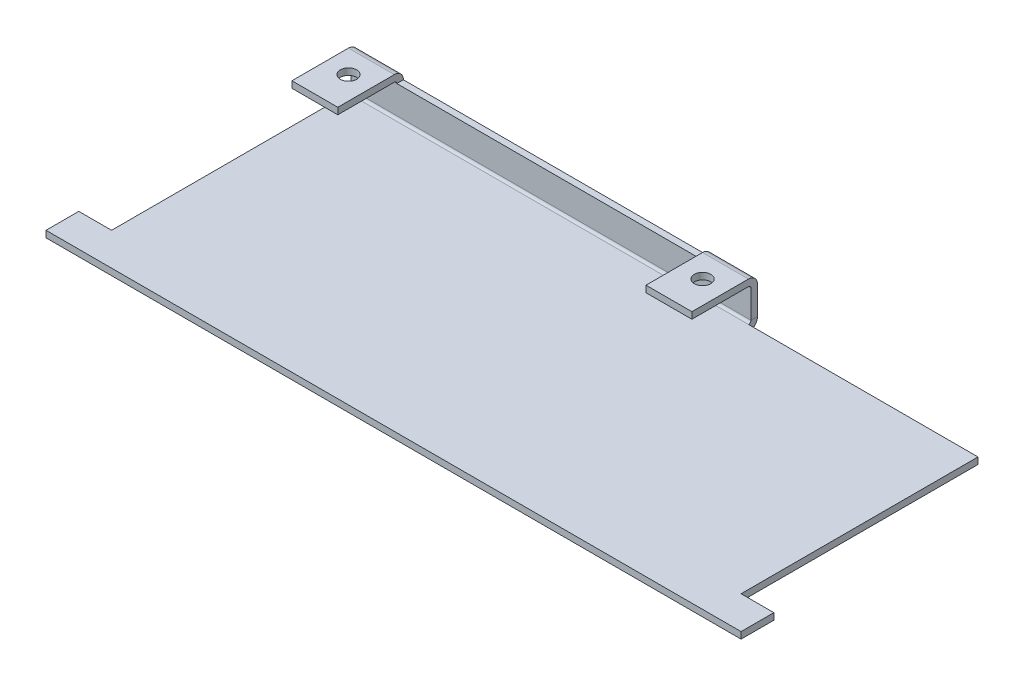
ISO-10303-21;
HEADER;
FILE_DESCRIPTION(('STEP AP214'),'2;1');
FILE_NAME('part.step','',(''),(''),'','','');
FILE_SCHEMA(('AUTOMOTIVE_DESIGN { 1 0 10303 214 1 1 1 1 }'));
ENDSEC;
DATA;
#1=APPLICATION_CONTEXT('core data for automotive mechanical design processes');
#2=APPLICATION_PROTOCOL_DEFINITION('international standard','automotive_design',2000,#1);
#3=PRODUCT_CONTEXT('',#1,'mechanical');
#4=PRODUCT('Part','Part','',(#3));
#5=PRODUCT_RELATED_PRODUCT_CATEGORY('part','',(#4));
#6=PRODUCT_DEFINITION_FORMATION('','',#4);
#7=PRODUCT_DEFINITION_CONTEXT('part definition',#1,'design');
#8=PRODUCT_DEFINITION('design','',#6,#7);
#9=PRODUCT_DEFINITION_SHAPE('','',#8);
#10=(LENGTH_UNIT() NAMED_UNIT(*) SI_UNIT(.MILLI.,.METRE.));
#11=(NAMED_UNIT(*) PLANE_ANGLE_UNIT() SI_UNIT($,.RADIAN.));
#12=(NAMED_UNIT(*) SI_UNIT($,.STERADIAN.) SOLID_ANGLE_UNIT());
#13=UNCERTAINTY_MEASURE_WITH_UNIT(LENGTH_MEASURE(1.E-05),#10,'distance_accuracy_value','');
#14=(GEOMETRIC_REPRESENTATION_CONTEXT(3) GLOBAL_UNCERTAINTY_ASSIGNED_CONTEXT((#13)) GLOBAL_UNIT_ASSIGNED_CONTEXT((#10,
#11,#12)) REPRESENTATION_CONTEXT('',''));
#15=CARTESIAN_POINT('',(0.,0.,0.));
#16=DIRECTION('',(0.,0.,1.));
#17=DIRECTION('',(1.,0.,0.));
#18=AXIS2_PLACEMENT_3D('',#15,#16,#17);
#19=CARTESIAN_POINT('',(0.,-3.60866551776955E-13,-85.));
#20=DIRECTION('',(0.,0.,1.));
#21=DIRECTION('',(0.,-1.,0.));
#22=AXIS2_PLACEMENT_3D('',#19,#20,#21);
#23=PLANE('',#22);
#24=DIRECTION('',(0.,-1.,0.));
#25=VECTOR('',#24,1.);
#26=CARTESIAN_POINT('',(132.,-3.62210261783957E-13,-85.));
#27=LINE('',#26,#25);
#28=CARTESIAN_POINT('',(132.,9.2634,-85.));
#29=VERTEX_POINT('',#28);
#30=CARTESIAN_POINT('',(132.,0.736599999999994,-85.));
#31=VERTEX_POINT('',#30);
#32=EDGE_CURVE('E318',#29,#31,#27,.T.);
#33=ORIENTED_EDGE('',*,*,#32,.T.);
#34=DIRECTION('',(-1.,0.,0.));
#35=VECTOR('',#34,1.);
#36=CARTESIAN_POINT('',(202.,0.736600000000018,-85.));
#37=LINE('',#36,#35);
#38=CARTESIAN_POINT('',(10.,0.736600000000032,-85.));
#39=VERTEX_POINT('',#38);
#40=EDGE_CURVE('E408',#39,#31,#37,.F.);
#41=ORIENTED_EDGE('',*,*,#40,.F.);
#42=DIRECTION('',(0.,1.,0.));
#43=VECTOR('',#42,1.);
#44=CARTESIAN_POINT('',(10.,-3.60866551776955E-13,-85.));
#45=LINE('',#44,#43);
#46=CARTESIAN_POINT('',(10.,9.26340000000001,-85.));
#47=VERTEX_POINT('',#46);
#48=EDGE_CURVE('E402',#39,#47,#45,.T.);
#49=ORIENTED_EDGE('',*,*,#48,.T.);
#50=DIRECTION('',(-1.,0.,0.));
#51=VECTOR('',#50,1.);
#52=CARTESIAN_POINT('',(10.,9.26340000000001,-85.));
#53=LINE('',#52,#51);
#54=CARTESIAN_POINT('',(24.,9.2634,-85.));
#55=VERTEX_POINT('',#54);
#56=EDGE_CURVE('E384',#47,#55,#53,.F.);
#57=ORIENTED_EDGE('',*,*,#56,.T.);
#58=DIRECTION('',(-1.,0.,0.));
#59=VECTOR('',#58,1.);
#60=CARTESIAN_POINT('',(118.,9.2634,-85.));
#61=LINE('',#60,#59);
#62=CARTESIAN_POINT('',(118.,9.2634,-85.));
#63=VERTEX_POINT('',#62);
#64=EDGE_CURVE('E325',#63,#55,#61,.T.);
#65=ORIENTED_EDGE('',*,*,#64,.F.);
#66=EDGE_CURVE('E388',#63,#29,#53,.F.);
#67=ORIENTED_EDGE('',*,*,#66,.T.);
#68=EDGE_LOOP('',(#33,#41,#49,#57,#65,#67));
#69=FACE_BOUND('',#68,.T.);
#70=ADVANCED_FACE('F62',(#69),#23,.F.);
#71=CARTESIAN_POINT('',(0.,-3.53883589099268E-13,-83.));
#72=DIRECTION('',(0.,0.,1.));
#73=DIRECTION('',(0.,-1.,0.));
#74=AXIS2_PLACEMENT_3D('',#71,#72,#73);
#75=PLANE('',#74);
#76=DIRECTION('',(-1.,0.,0.));
#77=VECTOR('',#76,1.);
#78=CARTESIAN_POINT('',(202.,0.736600000000004,-83.));
#79=LINE('',#78,#77);
#80=CARTESIAN_POINT('',(132.,0.736600000000003,-83.));
#81=VERTEX_POINT('',#80);
#82=CARTESIAN_POINT('',(10.,0.73660000000001,-83.));
#83=VERTEX_POINT('',#82);
#84=EDGE_CURVE('E401',#81,#83,#79,.T.);
#85=ORIENTED_EDGE('',*,*,#84,.F.);
#86=DIRECTION('',(0.,-1.,0.));
#87=VECTOR('',#86,1.);
#88=CARTESIAN_POINT('',(132.,-3.53883589099268E-13,-83.));
#89=LINE('',#88,#87);
#90=CARTESIAN_POINT('',(132.,9.26340000000001,-83.));
#91=VERTEX_POINT('',#90);
#92=EDGE_CURVE('E576',#91,#81,#89,.T.);
#93=ORIENTED_EDGE('',*,*,#92,.F.);
#94=DIRECTION('',(-1.,0.,0.));
#95=VECTOR('',#94,1.);
#96=CARTESIAN_POINT('',(10.,9.26340000000001,-83.));
#97=LINE('',#96,#95);
#98=CARTESIAN_POINT('',(118.,9.26340000000001,-83.));
#99=VERTEX_POINT('',#98);
#100=EDGE_CURVE('E396',#99,#91,#97,.F.);
#101=ORIENTED_EDGE('',*,*,#100,.F.);
#102=CARTESIAN_POINT('',(24.,9.26340000000001,-83.));
#103=VERTEX_POINT('',#102);
#104=EDGE_CURVE('E395',#103,#99,#97,.F.);
#105=ORIENTED_EDGE('',*,*,#104,.F.);
#106=CARTESIAN_POINT('',(10.,9.26340000000001,-83.));
#107=VERTEX_POINT('',#106);
#108=EDGE_CURVE('E392',#107,#103,#97,.F.);
#109=ORIENTED_EDGE('',*,*,#108,.F.);
#110=DIRECTION('',(0.,-1.,0.));
#111=VECTOR('',#110,1.);
#112=CARTESIAN_POINT('',(10.,10.,-83.));
#113=LINE('',#112,#111);
#114=EDGE_CURVE('E405',#83,#107,#113,.F.);
#115=ORIENTED_EDGE('',*,*,#114,.F.);
#116=EDGE_LOOP('',(#85,#93,#101,#105,#109,#115));
#117=FACE_BOUND('',#116,.T.);
#118=ADVANCED_FACE('F470',(#117),#75,.T.);
#119=CARTESIAN_POINT('',(10.,0.736600000000013,-82.2634));
#120=DIRECTION('',(-1.,0.,0.));
#121=DIRECTION('',(0.,0.,-1.));
#122=AXIS2_PLACEMENT_3D('',#119,#120,#121);
#123=CYLINDRICAL_SURFACE('',#122,2.7366);
#124=ORIENTED_EDGE('',*,*,#40,.T.);
#125=CARTESIAN_POINT('',(132.,0.736600000000004,-82.2634));
#126=DIRECTION('',(-1.,0.,0.));
#127=DIRECTION('',(0.,-1.,0.));
#128=AXIS2_PLACEMENT_3D('',#125,#126,#127);
#129=CIRCLE('',#128,2.7366);
#130=CARTESIAN_POINT('',(132.,-2.,-82.2634));
#131=VERTEX_POINT('',#130);
#132=EDGE_CURVE('E239',#131,#31,#129,.F.);
#133=ORIENTED_EDGE('',*,*,#132,.F.);
#134=DIRECTION('',(-1.,0.,0.));
#135=VECTOR('',#134,1.);
#136=CARTESIAN_POINT('',(10.,-1.99999999999999,-82.2634));
#137=LINE('',#136,#135);
#138=CARTESIAN_POINT('',(10.,-1.99999999999999,-82.2634));
#139=VERTEX_POINT('',#138);
#140=EDGE_CURVE('E237',#139,#131,#137,.F.);
#141=ORIENTED_EDGE('',*,*,#140,.F.);
#142=CARTESIAN_POINT('',(10.,0.736600000000013,-82.2634));
#143=DIRECTION('',(-1.,0.,0.));
#144=DIRECTION('',(0.,-1.,0.));
#145=AXIS2_PLACEMENT_3D('',#142,#143,#144);
#146=CIRCLE('',#145,2.7366);
#147=EDGE_CURVE('E416',#39,#139,#146,.T.);
#148=ORIENTED_EDGE('',*,*,#147,.F.);
#149=EDGE_LOOP('',(#124,#133,#141,#148));
#150=FACE_BOUND('',#149,.T.);
#151=ADVANCED_FACE('F477',(#150),#123,.T.);
#152=CARTESIAN_POINT('',(10.,0.736600000000013,-82.2634));
#153=DIRECTION('',(-1.,0.,0.));
#154=DIRECTION('',(0.,0.,-1.));
#155=AXIS2_PLACEMENT_3D('',#152,#153,#154);
#156=CYLINDRICAL_SURFACE('',#155,0.736600000000004);
#157=CARTESIAN_POINT('',(132.,0.736600000000004,-82.2634));
#158=DIRECTION('',(-1.,0.,0.));
#159=DIRECTION('',(0.,0.,1.));
#160=AXIS2_PLACEMENT_3D('',#157,#158,#159);
#161=CIRCLE('',#160,0.736600000000004);
#162=CARTESIAN_POINT('',(132.,0.,-82.2634));
#163=VERTEX_POINT('',#162);
#164=EDGE_CURVE('E581',#163,#81,#161,.F.);
#165=ORIENTED_EDGE('',*,*,#164,.T.);
#166=ORIENTED_EDGE('',*,*,#84,.T.);
#167=CARTESIAN_POINT('',(10.,0.736600000000013,-82.2634));
#168=DIRECTION('',(-1.,0.,0.));
#169=DIRECTION('',(0.,-1.,0.));
#170=AXIS2_PLACEMENT_3D('',#167,#168,#169);
#171=CIRCLE('',#170,0.736600000000004);
#172=CARTESIAN_POINT('',(10.,0.,-82.2634));
#173=VERTEX_POINT('',#172);
#174=EDGE_CURVE('E404',#83,#173,#171,.T.);
#175=ORIENTED_EDGE('',*,*,#174,.T.);
#176=DIRECTION('',(-1.,0.,0.));
#177=VECTOR('',#176,1.);
#178=CARTESIAN_POINT('',(10.,0.,-82.2634));
#179=LINE('',#178,#177);
#180=EDGE_CURVE('E419',#173,#163,#179,.F.);
#181=ORIENTED_EDGE('',*,*,#180,.T.);
#182=EDGE_LOOP('',(#165,#166,#175,#181));
#183=FACE_BOUND('',#182,.T.);
#184=ADVANCED_FACE('F427',(#183),#156,.F.);
#185=CARTESIAN_POINT('',(118.,9.2634,-85.));
#186=DIRECTION('',(1.,0.,0.));
#187=DIRECTION('',(0.,0.,-1.));
#188=AXIS2_PLACEMENT_3D('',#185,#186,#187);
#189=PLANE('',#188);
#190=DIRECTION('',(0.,0.,-1.));
#191=VECTOR('',#190,1.);
#192=CARTESIAN_POINT('',(118.,12.,-85.));
#193=LINE('',#192,#191);
#194=CARTESIAN_POINT('',(118.,12.0000000000002,-65.));
#195=VERTEX_POINT('',#194);
#196=CARTESIAN_POINT('',(118.,12.0000000000001,-82.2634000000001));
#197=VERTEX_POINT('',#196);
#198=EDGE_CURVE('E303',#195,#197,#193,.T.);
#199=ORIENTED_EDGE('',*,*,#198,.T.);
#200=DIRECTION('',(0.,-1.,0.));
#201=VECTOR('',#200,1.);
#202=CARTESIAN_POINT('',(118.,12.0000000000001,-82.2634000000001));
#203=LINE('',#202,#201);
#204=CARTESIAN_POINT('',(118.,10.,-82.2634));
#205=VERTEX_POINT('',#204);
#206=EDGE_CURVE('E13',#197,#205,#203,.T.);
#207=ORIENTED_EDGE('',*,*,#206,.T.);
#208=DIRECTION('',(0.,0.,1.));
#209=VECTOR('',#208,1.);
#210=CARTESIAN_POINT('',(118.,10.0000000000006,0.));
#211=LINE('',#210,#209);
#212=CARTESIAN_POINT('',(118.,10.0000000000001,-65.));
#213=VERTEX_POINT('',#212);
#214=EDGE_CURVE('E341',#205,#213,#211,.T.);
#215=ORIENTED_EDGE('',*,*,#214,.T.);
#216=DIRECTION('',(0.,-1.,0.));
#217=VECTOR('',#216,1.);
#218=CARTESIAN_POINT('',(118.,12.0000000000001,-65.));
#219=LINE('',#218,#217);
#220=EDGE_CURVE('E70',#195,#213,#219,.T.);
#221=ORIENTED_EDGE('',*,*,#220,.F.);
#222=EDGE_LOOP('',(#199,#207,#215,#221));
#223=FACE_BOUND('',#222,.T.);
#224=ADVANCED_FACE('F493',(#223),#189,.F.);
#225=CARTESIAN_POINT('',(10.,9.26340000000001,-82.2634));
#226=DIRECTION('',(-1.,0.,0.));
#227=DIRECTION('',(0.,1.,0.));
#228=AXIS2_PLACEMENT_3D('',#225,#226,#227);
#229=CYLINDRICAL_SURFACE('',#228,2.7366);
#230=CARTESIAN_POINT('',(118.,9.26340000000001,-82.2634));
#231=DIRECTION('',(1.,0.,0.));
#232=DIRECTION('',(0.,0.,-1.));
#233=AXIS2_PLACEMENT_3D('',#230,#231,#232);
#234=CIRCLE('',#233,2.7366);
#235=EDGE_CURVE('E346',#197,#63,#234,.F.);
#236=ORIENTED_EDGE('',*,*,#235,.F.);
#237=DIRECTION('',(1.,0.,0.));
#238=VECTOR('',#237,1.);
#239=CARTESIAN_POINT('',(0.,12.,-82.2634000000001));
#240=LINE('',#239,#238);
#241=CARTESIAN_POINT('',(132.,12.0000000000001,-82.2634000000001));
#242=VERTEX_POINT('',#241);
#243=EDGE_CURVE('E365',#197,#242,#240,.T.);
#244=ORIENTED_EDGE('',*,*,#243,.T.);
#245=CARTESIAN_POINT('',(132.,9.26340000000001,-82.2634));
#246=DIRECTION('',(-1.,0.,0.));
#247=DIRECTION('',(0.,0.,1.));
#248=AXIS2_PLACEMENT_3D('',#245,#246,#247);
#249=CIRCLE('',#248,2.7366);
#250=EDGE_CURVE('E355',#29,#242,#249,.F.);
#251=ORIENTED_EDGE('',*,*,#250,.F.);
#252=ORIENTED_EDGE('',*,*,#66,.F.);
#253=EDGE_LOOP('',(#236,#244,#251,#252));
#254=FACE_BOUND('',#253,.T.);
#255=ADVANCED_FACE('F498',(#254),#229,.T.);
#256=CARTESIAN_POINT('',(10.,9.26340000000001,-82.2634));
#257=DIRECTION('',(-1.,0.,0.));
#258=DIRECTION('',(0.,1.,0.));
#259=AXIS2_PLACEMENT_3D('',#256,#257,#258);
#260=CYLINDRICAL_SURFACE('',#259,0.736599999999997);
#261=DIRECTION('',(-1.,0.,0.));
#262=VECTOR('',#261,1.);
#263=CARTESIAN_POINT('',(202.,10.,-82.2634));
#264=LINE('',#263,#262);
#265=CARTESIAN_POINT('',(132.,10.,-82.2634));
#266=VERTEX_POINT('',#265);
#267=EDGE_CURVE('E359',#266,#205,#264,.T.);
#268=ORIENTED_EDGE('',*,*,#267,.T.);
#269=CARTESIAN_POINT('',(118.,9.26340000000001,-82.2634));
#270=DIRECTION('',(1.,0.,0.));
#271=DIRECTION('',(0.,0.,-1.));
#272=AXIS2_PLACEMENT_3D('',#269,#270,#271);
#273=CIRCLE('',#272,0.736599999999997);
#274=EDGE_CURVE('E343',#205,#99,#273,.F.);
#275=ORIENTED_EDGE('',*,*,#274,.T.);
#276=ORIENTED_EDGE('',*,*,#100,.T.);
#277=CARTESIAN_POINT('',(132.,9.26340000000001,-82.2634));
#278=DIRECTION('',(-1.,0.,0.));
#279=DIRECTION('',(0.,0.,1.));
#280=AXIS2_PLACEMENT_3D('',#277,#278,#279);
#281=CIRCLE('',#280,0.736599999999997);
#282=EDGE_CURVE('E352',#91,#266,#281,.F.);
#283=ORIENTED_EDGE('',*,*,#282,.T.);
#284=EDGE_LOOP('',(#268,#275,#276,#283));
#285=FACE_BOUND('',#284,.T.);
#286=ADVANCED_FACE('F506',(#285),#260,.F.);
#287=CARTESIAN_POINT('',(0.,12.0000000000006,0.));
#288=DIRECTION('',(0.,-1.,0.));
#289=DIRECTION('',(0.,0.,-1.));
#290=AXIS2_PLACEMENT_3D('',#287,#288,#289);
#291=PLANE('',#290);
#292=CARTESIAN_POINT('',(125.,12.0000000000001,-75.2634));
#293=DIRECTION('',(0.,1.,0.));
#294=DIRECTION('',(0.,0.,1.));
#295=AXIS2_PLACEMENT_3D('',#292,#293,#294);
#296=CIRCLE('',#295,2.5);
#297=CARTESIAN_POINT('',(125.,12.0000000000001,-72.7634));
#298=VERTEX_POINT('',#297);
#299=EDGE_CURVE('E304',#298,#298,#296,.T.);
#300=ORIENTED_EDGE('',*,*,#299,.F.);
#301=EDGE_LOOP('',(#300));
#302=FACE_BOUND('',#301,.T.);
#303=ORIENTED_EDGE('',*,*,#243,.F.);
#304=ORIENTED_EDGE('',*,*,#198,.F.);
#305=DIRECTION('',(1.,0.,0.));
#306=VECTOR('',#305,1.);
#307=CARTESIAN_POINT('',(202.,12.0000000000001,-65.));
#308=LINE('',#307,#306);
#309=CARTESIAN_POINT('',(132.,12.0000000000001,-65.));
#310=VERTEX_POINT('',#309);
#311=EDGE_CURVE('E85',#195,#310,#308,.T.);
#312=ORIENTED_EDGE('',*,*,#311,.T.);
#313=DIRECTION('',(0.,0.,1.));
#314=VECTOR('',#313,1.);
#315=CARTESIAN_POINT('',(132.,12.0000000000002,-65.));
#316=LINE('',#315,#314);
#317=EDGE_CURVE('E348',#242,#310,#316,.T.);
#318=ORIENTED_EDGE('',*,*,#317,.F.);
#319=EDGE_LOOP('',(#303,#304,#312,#318));
#320=FACE_BOUND('',#319,.T.);
#321=ADVANCED_FACE('F533',(#302,#320),#291,.F.);
#322=CARTESIAN_POINT('',(0.,10.0000000000006,0.));
#323=DIRECTION('',(0.,-1.,0.));
#324=DIRECTION('',(0.,0.,-1.));
#325=AXIS2_PLACEMENT_3D('',#322,#323,#324);
#326=PLANE('',#325);
#327=CARTESIAN_POINT('',(125.,10.0000000000001,-75.2634));
#328=DIRECTION('',(0.,-1.,0.));
#329=DIRECTION('',(0.,0.,-1.));
#330=AXIS2_PLACEMENT_3D('',#327,#328,#329);
#331=CIRCLE('',#330,2.5);
#332=CARTESIAN_POINT('',(125.,10.,-77.7634));
#333=VERTEX_POINT('',#332);
#334=EDGE_CURVE('E301',#333,#333,#331,.T.);
#335=ORIENTED_EDGE('',*,*,#334,.F.);
#336=EDGE_LOOP('',(#335));
#337=FACE_BOUND('',#336,.T.);
#338=ORIENTED_EDGE('',*,*,#214,.F.);
#339=ORIENTED_EDGE('',*,*,#267,.F.);
#340=DIRECTION('',(0.,0.,-1.));
#341=VECTOR('',#340,1.);
#342=CARTESIAN_POINT('',(132.,10.0000000000006,0.));
#343=LINE('',#342,#341);
#344=CARTESIAN_POINT('',(132.,10.0000000000001,-65.));
#345=VERTEX_POINT('',#344);
#346=EDGE_CURVE('E350',#345,#266,#343,.T.);
#347=ORIENTED_EDGE('',*,*,#346,.F.);
#348=DIRECTION('',(1.,0.,0.));
#349=VECTOR('',#348,1.);
#350=CARTESIAN_POINT('',(202.,10.0000000000001,-65.));
#351=LINE('',#350,#349);
#352=EDGE_CURVE('E378',#213,#345,#351,.T.);
#353=ORIENTED_EDGE('',*,*,#352,.F.);
#354=EDGE_LOOP('',(#338,#339,#347,#353));
#355=FACE_BOUND('',#354,.T.);
#356=ADVANCED_FACE('F540',(#337,#355),#326,.T.);
#357=CARTESIAN_POINT('',(202.,12.0000000000001,-65.));
#358=DIRECTION('',(0.,0.,-1.));
#359=DIRECTION('',(0.,1.,0.));
#360=AXIS2_PLACEMENT_3D('',#357,#358,#359);
#361=PLANE('',#360);
#362=ORIENTED_EDGE('',*,*,#311,.F.);
#363=ORIENTED_EDGE('',*,*,#220,.T.);
#364=ORIENTED_EDGE('',*,*,#352,.T.);
#365=DIRECTION('',(0.,1.,0.));
#366=VECTOR('',#365,1.);
#367=CARTESIAN_POINT('',(132.,12.0000000000001,-65.));
#368=LINE('',#367,#366);
#369=EDGE_CURVE('E292',#345,#310,#368,.T.);
#370=ORIENTED_EDGE('',*,*,#369,.T.);
#371=EDGE_LOOP('',(#362,#363,#364,#370));
#372=FACE_BOUND('',#371,.T.);
#373=ADVANCED_FACE('F487',(#372),#361,.F.);
#374=CARTESIAN_POINT('',(10.,10.,-85.));
#375=DIRECTION('',(1.,0.,0.));
#376=DIRECTION('',(0.,0.,-1.));
#377=AXIS2_PLACEMENT_3D('',#374,#375,#376);
#378=PLANE('',#377);
#379=DIRECTION('',(0.,0.,-1.));
#380=VECTOR('',#379,1.);
#381=CARTESIAN_POINT('',(10.,9.26340000000001,-83.));
#382=LINE('',#381,#380);
#383=EDGE_CURVE('E387',#107,#47,#382,.T.);
#384=ORIENTED_EDGE('',*,*,#383,.T.);
#385=ORIENTED_EDGE('',*,*,#48,.F.);
#386=DIRECTION('',(0.,0.,1.));
#387=VECTOR('',#386,1.);
#388=CARTESIAN_POINT('',(10.,0.736600000000018,-83.));
#389=LINE('',#388,#387);
#390=EDGE_CURVE('E411',#83,#39,#389,.F.);
#391=ORIENTED_EDGE('',*,*,#390,.F.);
#392=ORIENTED_EDGE('',*,*,#114,.T.);
#393=EDGE_LOOP('',(#384,#385,#391,#392));
#394=FACE_BOUND('',#393,.T.);
#395=ADVANCED_FACE('F484',(#394),#378,.F.);
#396=CARTESIAN_POINT('',(0.,-2.,0.));
#397=DIRECTION('',(0.,-1.,0.));
#398=DIRECTION('',(0.,0.,-1.));
#399=AXIS2_PLACEMENT_3D('',#396,#397,#398);
#400=PLANE('',#399);
#401=DIRECTION('',(0.,0.,-1.));
#402=VECTOR('',#401,1.);
#403=CARTESIAN_POINT('',(10.,-2.,-85.));
#404=LINE('',#403,#402);
#405=CARTESIAN_POINT('',(10.,-2.,-9.99999999999998));
#406=VERTEX_POINT('',#405);
#407=EDGE_CURVE('E257',#406,#139,#404,.T.);
#408=ORIENTED_EDGE('',*,*,#407,.T.);
#409=ORIENTED_EDGE('',*,*,#140,.T.);
#410=DIRECTION('',(-1.,0.,0.));
#411=VECTOR('',#410,1.);
#412=CARTESIAN_POINT('',(10.,-1.99999999999999,-82.2634));
#413=LINE('',#412,#411);
#414=CARTESIAN_POINT('',(202.,-2.00000000000001,-82.2634));
#415=VERTEX_POINT('',#414);
#416=EDGE_CURVE('E221',#131,#415,#413,.F.);
#417=ORIENTED_EDGE('',*,*,#416,.T.);
#418=DIRECTION('',(0.,0.,1.));
#419=VECTOR('',#418,1.);
#420=CARTESIAN_POINT('',(202.,-2.,-85.));
#421=LINE('',#420,#419);
#422=CARTESIAN_POINT('',(202.,-2.,-9.99999999999999));
#423=VERTEX_POINT('',#422);
#424=EDGE_CURVE('E228',#415,#423,#421,.T.);
#425=ORIENTED_EDGE('',*,*,#424,.T.);
#426=DIRECTION('',(1.,0.,0.));
#427=VECTOR('',#426,1.);
#428=CARTESIAN_POINT('',(212.,-2.,-10.));
#429=LINE('',#428,#427);
#430=CARTESIAN_POINT('',(212.,-2.,-10.));
#431=VERTEX_POINT('',#430);
#432=EDGE_CURVE('E245',#423,#431,#429,.T.);
#433=ORIENTED_EDGE('',*,*,#432,.T.);
#434=DIRECTION('',(0.,0.,-1.));
#435=VECTOR('',#434,1.);
#436=CARTESIAN_POINT('',(212.,-2.,0.));
#437=LINE('',#436,#435);
#438=CARTESIAN_POINT('',(212.,-2.,0.));
#439=VERTEX_POINT('',#438);
#440=EDGE_CURVE('E280',#439,#431,#437,.T.);
#441=ORIENTED_EDGE('',*,*,#440,.F.);
#442=DIRECTION('',(1.,0.,0.));
#443=VECTOR('',#442,1.);
#444=CARTESIAN_POINT('',(0.,-2.,0.));
#445=LINE('',#444,#443);
#446=CARTESIAN_POINT('',(0.,-2.,0.));
#447=VERTEX_POINT('',#446);
#448=EDGE_CURVE('E276',#447,#439,#445,.T.);
#449=ORIENTED_EDGE('',*,*,#448,.F.);
#450=DIRECTION('',(0.,0.,1.));
#451=VECTOR('',#450,1.);
#452=CARTESIAN_POINT('',(0.,-2.,0.));
#453=LINE('',#452,#451);
#454=CARTESIAN_POINT('',(0.,-2.,-9.99999999999998));
#455=VERTEX_POINT('',#454);
#456=EDGE_CURVE('E274',#455,#447,#453,.T.);
#457=ORIENTED_EDGE('',*,*,#456,.F.);
#458=DIRECTION('',(1.,0.,0.));
#459=VECTOR('',#458,1.);
#460=CARTESIAN_POINT('',(0.,-2.,-9.99999999999998));
#461=LINE('',#460,#459);
#462=EDGE_CURVE('E269',#455,#406,#461,.T.);
#463=ORIENTED_EDGE('',*,*,#462,.T.);
#464=EDGE_LOOP('',(#408,#409,#417,#425,#433,#441,#449,#457,#463));
#465=FACE_BOUND('',#464,.T.);
#466=ADVANCED_FACE('F234',(#465),#400,.T.);
#467=CARTESIAN_POINT('',(0.,0.,0.));
#468=DIRECTION('',(0.,-1.,0.));
#469=DIRECTION('',(0.,0.,-1.));
#470=AXIS2_PLACEMENT_3D('',#467,#468,#469);
#471=PLANE('',#470);
#472=ORIENTED_EDGE('',*,*,#180,.F.);
#473=DIRECTION('',(0.,0.,-1.));
#474=VECTOR('',#473,1.);
#475=CARTESIAN_POINT('',(10.,0.,-85.));
#476=LINE('',#475,#474);
#477=CARTESIAN_POINT('',(10.,0.,-9.99999999999998));
#478=VERTEX_POINT('',#477);
#479=EDGE_CURVE('E263',#478,#173,#476,.T.);
#480=ORIENTED_EDGE('',*,*,#479,.F.);
#481=DIRECTION('',(1.,0.,0.));
#482=VECTOR('',#481,1.);
#483=CARTESIAN_POINT('',(0.,0.,-9.99999999999998));
#484=LINE('',#483,#482);
#485=CARTESIAN_POINT('',(0.,0.,-9.99999999999998));
#486=VERTEX_POINT('',#485);
#487=EDGE_CURVE('E260',#486,#478,#484,.T.);
#488=ORIENTED_EDGE('',*,*,#487,.F.);
#489=DIRECTION('',(0.,0.,1.));
#490=VECTOR('',#489,1.);
#491=CARTESIAN_POINT('',(0.,0.,0.));
#492=LINE('',#491,#490);
#493=CARTESIAN_POINT('',(0.,0.,0.));
#494=VERTEX_POINT('',#493);
#495=EDGE_CURVE('E273',#486,#494,#492,.T.);
#496=ORIENTED_EDGE('',*,*,#495,.T.);
#497=DIRECTION('',(1.,0.,0.));
#498=VECTOR('',#497,1.);
#499=CARTESIAN_POINT('',(0.,0.,0.));
#500=LINE('',#499,#498);
#501=CARTESIAN_POINT('',(212.,0.,0.));
#502=VERTEX_POINT('',#501);
#503=EDGE_CURVE('E285',#494,#502,#500,.T.);
#504=ORIENTED_EDGE('',*,*,#503,.T.);
#505=DIRECTION('',(0.,0.,-1.));
#506=VECTOR('',#505,1.);
#507=CARTESIAN_POINT('',(212.,0.,0.));
#508=LINE('',#507,#506);
#509=CARTESIAN_POINT('',(212.,0.,-10.));
#510=VERTEX_POINT('',#509);
#511=EDGE_CURVE('E277',#502,#510,#508,.T.);
#512=ORIENTED_EDGE('',*,*,#511,.T.);
#513=DIRECTION('',(1.,0.,0.));
#514=VECTOR('',#513,1.);
#515=CARTESIAN_POINT('',(212.,0.,-10.));
#516=LINE('',#515,#514);
#517=CARTESIAN_POINT('',(202.,0.,-10.));
#518=VERTEX_POINT('',#517);
#519=EDGE_CURVE('E252',#518,#510,#516,.T.);
#520=ORIENTED_EDGE('',*,*,#519,.F.);
#521=DIRECTION('',(0.,0.,1.));
#522=VECTOR('',#521,1.);
#523=CARTESIAN_POINT('',(202.,0.,-85.));
#524=LINE('',#523,#522);
#525=CARTESIAN_POINT('',(202.,0.,-82.2634));
#526=VERTEX_POINT('',#525);
#527=EDGE_CURVE('E247',#526,#518,#524,.T.);
#528=ORIENTED_EDGE('',*,*,#527,.F.);
#529=DIRECTION('',(-1.,0.,0.));
#530=VECTOR('',#529,1.);
#531=CARTESIAN_POINT('',(10.,0.,-82.2634));
#532=LINE('',#531,#530);
#533=EDGE_CURVE('E224',#163,#526,#532,.F.);
#534=ORIENTED_EDGE('',*,*,#533,.F.);
#535=EDGE_LOOP('',(#472,#480,#488,#496,#504,#512,#520,#528,#534));
#536=FACE_BOUND('',#535,.T.);
#537=ADVANCED_FACE('F433',(#536),#471,.F.);
#538=CARTESIAN_POINT('',(10.,-2.001,-85.));
#539=DIRECTION('',(1.,0.,0.));
#540=DIRECTION('',(0.,0.,-1.));
#541=AXIS2_PLACEMENT_3D('',#538,#539,#540);
#542=PLANE('',#541);
#543=DIRECTION('',(0.,-1.,0.));
#544=VECTOR('',#543,1.);
#545=CARTESIAN_POINT('',(10.,0.,-82.2634));
#546=LINE('',#545,#544);
#547=EDGE_CURVE('E229',#173,#139,#546,.T.);
#548=ORIENTED_EDGE('',*,*,#547,.T.);
#549=ORIENTED_EDGE('',*,*,#407,.F.);
#550=DIRECTION('',(0.,1.,0.));
#551=VECTOR('',#550,1.);
#552=CARTESIAN_POINT('',(10.,-2.001,-9.99999999999998));
#553=LINE('',#552,#551);
#554=EDGE_CURVE('E267',#406,#478,#553,.T.);
#555=ORIENTED_EDGE('',*,*,#554,.T.);
#556=ORIENTED_EDGE('',*,*,#479,.T.);
#557=EDGE_LOOP('',(#548,#549,#555,#556));
#558=FACE_BOUND('',#557,.T.);
#559=ADVANCED_FACE('F437',(#558),#542,.F.);
#560=CARTESIAN_POINT('',(202.,-2.001,-85.));
#561=DIRECTION('',(-1.,0.,0.));
#562=DIRECTION('',(0.,0.,1.));
#563=AXIS2_PLACEMENT_3D('',#560,#561,#562);
#564=PLANE('',#563);
#565=DIRECTION('',(0.,-1.,0.));
#566=VECTOR('',#565,1.);
#567=CARTESIAN_POINT('',(202.,0.,-82.2634));
#568=LINE('',#567,#566);
#569=EDGE_CURVE('E217',#526,#415,#568,.T.);
#570=ORIENTED_EDGE('',*,*,#569,.F.);
#571=ORIENTED_EDGE('',*,*,#527,.T.);
#572=DIRECTION('',(0.,1.,0.));
#573=VECTOR('',#572,1.);
#574=CARTESIAN_POINT('',(202.,-2.001,-10.));
#575=LINE('',#574,#573);
#576=EDGE_CURVE('E244',#423,#518,#575,.T.);
#577=ORIENTED_EDGE('',*,*,#576,.F.);
#578=ORIENTED_EDGE('',*,*,#424,.F.);
#579=EDGE_LOOP('',(#570,#571,#577,#578));
#580=FACE_BOUND('',#579,.T.);
#581=ADVANCED_FACE('F242',(#580),#564,.F.);
#582=CARTESIAN_POINT('',(0.,-2.,0.));
#583=DIRECTION('',(-1.,0.,0.));
#584=DIRECTION('',(0.,0.,1.));
#585=AXIS2_PLACEMENT_3D('',#582,#583,#584);
#586=PLANE('',#585);
#587=DIRECTION('',(0.,1.,0.));
#588=VECTOR('',#587,1.);
#589=CARTESIAN_POINT('',(0.,-2.001,-9.99999999999998));
#590=LINE('',#589,#588);
#591=EDGE_CURVE('E266',#455,#486,#590,.T.);
#592=ORIENTED_EDGE('',*,*,#591,.F.);
#593=ORIENTED_EDGE('',*,*,#456,.T.);
#594=DIRECTION('',(0.,1.,0.));
#595=VECTOR('',#594,1.);
#596=CARTESIAN_POINT('',(0.,-2.,0.));
#597=LINE('',#596,#595);
#598=EDGE_CURVE('E283',#447,#494,#597,.T.);
#599=ORIENTED_EDGE('',*,*,#598,.T.);
#600=ORIENTED_EDGE('',*,*,#495,.F.);
#601=EDGE_LOOP('',(#592,#593,#599,#600));
#602=FACE_BOUND('',#601,.T.);
#603=ADVANCED_FACE('F64',(#602),#586,.T.);
#604=CARTESIAN_POINT('',(212.,-2.,0.));
#605=DIRECTION('',(1.,0.,0.));
#606=DIRECTION('',(0.,0.,-1.));
#607=AXIS2_PLACEMENT_3D('',#604,#605,#606);
#608=PLANE('',#607);
#609=DIRECTION('',(0.,1.,0.));
#610=VECTOR('',#609,1.);
#611=CARTESIAN_POINT('',(212.,-2.001,-10.));
#612=LINE('',#611,#610);
#613=EDGE_CURVE('E254',#431,#510,#612,.T.);
#614=ORIENTED_EDGE('',*,*,#613,.T.);
#615=ORIENTED_EDGE('',*,*,#511,.F.);
#616=DIRECTION('',(0.,1.,0.));
#617=VECTOR('',#616,1.);
#618=CARTESIAN_POINT('',(212.,-2.,0.));
#619=LINE('',#618,#617);
#620=EDGE_CURVE('E290',#439,#502,#619,.T.);
#621=ORIENTED_EDGE('',*,*,#620,.F.);
#622=ORIENTED_EDGE('',*,*,#440,.T.);
#623=EDGE_LOOP('',(#614,#615,#621,#622));
#624=FACE_BOUND('',#623,.T.);
#625=ADVANCED_FACE('F453',(#624),#608,.T.);
#626=CARTESIAN_POINT('',(0.,-2.,0.));
#627=DIRECTION('',(0.,0.,1.));
#628=DIRECTION('',(1.,0.,0.));
#629=AXIS2_PLACEMENT_3D('',#626,#627,#628);
#630=PLANE('',#629);
#631=ORIENTED_EDGE('',*,*,#503,.F.);
#632=ORIENTED_EDGE('',*,*,#598,.F.);
#633=ORIENTED_EDGE('',*,*,#448,.T.);
#634=ORIENTED_EDGE('',*,*,#620,.T.);
#635=EDGE_LOOP('',(#631,#632,#633,#634));
#636=FACE_BOUND('',#635,.T.);
#637=ADVANCED_FACE('F449',(#636),#630,.T.);
#638=CARTESIAN_POINT('',(0.,-2.001,-9.99999999999998));
#639=DIRECTION('',(0.,0.,1.));
#640=DIRECTION('',(1.,0.,0.));
#641=AXIS2_PLACEMENT_3D('',#638,#639,#640);
#642=PLANE('',#641);
#643=ORIENTED_EDGE('',*,*,#591,.T.);
#644=ORIENTED_EDGE('',*,*,#487,.T.);
#645=ORIENTED_EDGE('',*,*,#554,.F.);
#646=ORIENTED_EDGE('',*,*,#462,.F.);
#647=EDGE_LOOP('',(#643,#644,#645,#646));
#648=FACE_BOUND('',#647,.T.);
#649=ADVANCED_FACE('F440',(#648),#642,.F.);
#650=CARTESIAN_POINT('',(212.,-2.001,-10.));
#651=DIRECTION('',(0.,0.,1.));
#652=DIRECTION('',(1.,0.,0.));
#653=AXIS2_PLACEMENT_3D('',#650,#651,#652);
#654=PLANE('',#653);
#655=ORIENTED_EDGE('',*,*,#576,.T.);
#656=ORIENTED_EDGE('',*,*,#519,.T.);
#657=ORIENTED_EDGE('',*,*,#613,.F.);
#658=ORIENTED_EDGE('',*,*,#432,.F.);
#659=EDGE_LOOP('',(#655,#656,#657,#658));
#660=FACE_BOUND('',#659,.T.);
#661=ADVANCED_FACE('F456',(#660),#654,.F.);
#662=CARTESIAN_POINT('',(10.,0.736600000000013,-82.2634));
#663=DIRECTION('',(1.,0.,0.));
#664=DIRECTION('',(0.,1.,0.));
#665=AXIS2_PLACEMENT_3D('',#662,#663,#664);
#666=PLANE('',#665);
#667=ORIENTED_EDGE('',*,*,#174,.F.);
#668=ORIENTED_EDGE('',*,*,#390,.T.);
#669=ORIENTED_EDGE('',*,*,#147,.T.);
#670=ORIENTED_EDGE('',*,*,#547,.F.);
#671=EDGE_LOOP('',(#667,#668,#669,#670));
#672=FACE_BOUND('',#671,.T.);
#673=ADVANCED_FACE('F458',(#672),#666,.F.);
#674=CARTESIAN_POINT('',(10.,9.26340000000001,-82.2634));
#675=DIRECTION('',(1.,0.,0.));
#676=DIRECTION('',(0.,0.,-1.));
#677=AXIS2_PLACEMENT_3D('',#674,#675,#676);
#678=PLANE('',#677);
#679=CARTESIAN_POINT('',(10.,9.26340000000001,-82.2634));
#680=DIRECTION('',(-1.,0.,0.));
#681=DIRECTION('',(0.,0.,1.));
#682=AXIS2_PLACEMENT_3D('',#679,#680,#681);
#683=CIRCLE('',#682,0.736599999999997);
#684=CARTESIAN_POINT('',(10.,10.,-82.2634));
#685=VERTEX_POINT('',#684);
#686=EDGE_CURVE('E383',#685,#107,#683,.T.);
#687=ORIENTED_EDGE('',*,*,#686,.F.);
#688=DIRECTION('',(0.,1.,0.));
#689=VECTOR('',#688,1.);
#690=CARTESIAN_POINT('',(10.,10.,-82.2634));
#691=LINE('',#690,#689);
#692=CARTESIAN_POINT('',(10.,12.,-82.2634000000001));
#693=VERTEX_POINT('',#692);
#694=EDGE_CURVE('E362',#685,#693,#691,.T.);
#695=ORIENTED_EDGE('',*,*,#694,.T.);
#696=CARTESIAN_POINT('',(10.,9.26340000000001,-82.2634));
#697=DIRECTION('',(-1.,0.,0.));
#698=DIRECTION('',(0.,0.,1.));
#699=AXIS2_PLACEMENT_3D('',#696,#697,#698);
#700=CIRCLE('',#699,2.7366);
#701=EDGE_CURVE('E389',#693,#47,#700,.T.);
#702=ORIENTED_EDGE('',*,*,#701,.T.);
#703=ORIENTED_EDGE('',*,*,#383,.F.);
#704=EDGE_LOOP('',(#687,#695,#702,#703));
#705=FACE_BOUND('',#704,.T.);
#706=ADVANCED_FACE('F465',(#705),#678,.F.);
#707=CARTESIAN_POINT('',(24.,9.26340000000001,-82.2634));
#708=DIRECTION('',(-1.,0.,0.));
#709=DIRECTION('',(0.,0.,1.));
#710=AXIS2_PLACEMENT_3D('',#707,#708,#709);
#711=CIRCLE('',#710,2.7366);
#712=CARTESIAN_POINT('',(24.,12.0000000000001,-82.2634000000001));
#713=VERTEX_POINT('',#712);
#714=EDGE_CURVE('E339',#55,#713,#711,.F.);
#715=ORIENTED_EDGE('',*,*,#714,.F.);
#716=ORIENTED_EDGE('',*,*,#56,.F.);
#717=ORIENTED_EDGE('',*,*,#701,.F.);
#718=EDGE_CURVE('E366',#693,#713,#240,.T.);
#719=ORIENTED_EDGE('',*,*,#718,.T.);
#720=EDGE_LOOP('',(#715,#716,#717,#719));
#721=FACE_BOUND('',#720,.T.);
#722=ADVANCED_FACE('F509',(#721),#229,.T.);
#723=ORIENTED_EDGE('',*,*,#108,.T.);
#724=CARTESIAN_POINT('',(24.,9.26340000000001,-82.2634));
#725=DIRECTION('',(-1.,0.,0.));
#726=DIRECTION('',(0.,0.,1.));
#727=AXIS2_PLACEMENT_3D('',#724,#725,#726);
#728=CIRCLE('',#727,0.736599999999997);
#729=CARTESIAN_POINT('',(24.,10.,-82.2634));
#730=VERTEX_POINT('',#729);
#731=EDGE_CURVE('E336',#103,#730,#728,.F.);
#732=ORIENTED_EDGE('',*,*,#731,.T.);
#733=EDGE_CURVE('E358',#730,#685,#264,.T.);
#734=ORIENTED_EDGE('',*,*,#733,.T.);
#735=ORIENTED_EDGE('',*,*,#686,.T.);
#736=EDGE_LOOP('',(#723,#732,#734,#735));
#737=FACE_BOUND('',#736,.T.);
#738=ADVANCED_FACE('F550',(#737),#260,.F.);
#739=CARTESIAN_POINT('',(10.,12.0000000000001,-65.));
#740=DIRECTION('',(1.,0.,0.));
#741=DIRECTION('',(0.,0.,-1.));
#742=AXIS2_PLACEMENT_3D('',#739,#740,#741);
#743=PLANE('',#742);
#744=ORIENTED_EDGE('',*,*,#694,.F.);
#745=DIRECTION('',(0.,0.,1.));
#746=VECTOR('',#745,1.);
#747=CARTESIAN_POINT('',(10.,10.0000000000001,-65.));
#748=LINE('',#747,#746);
#749=CARTESIAN_POINT('',(10.,10.0000000000001,-65.));
#750=VERTEX_POINT('',#749);
#751=EDGE_CURVE('E369',#685,#750,#748,.T.);
#752=ORIENTED_EDGE('',*,*,#751,.T.);
#753=DIRECTION('',(0.,-1.,0.));
#754=VECTOR('',#753,1.);
#755=CARTESIAN_POINT('',(10.,12.0000000000001,-65.));
#756=LINE('',#755,#754);
#757=CARTESIAN_POINT('',(10.,12.0000000000001,-65.));
#758=VERTEX_POINT('',#757);
#759=EDGE_CURVE('E376',#758,#750,#756,.T.);
#760=ORIENTED_EDGE('',*,*,#759,.F.);
#761=DIRECTION('',(0.,0.,1.));
#762=VECTOR('',#761,1.);
#763=CARTESIAN_POINT('',(10.,12.0000000000001,-65.));
#764=LINE('',#763,#762);
#765=EDGE_CURVE('E370',#693,#758,#764,.T.);
#766=ORIENTED_EDGE('',*,*,#765,.F.);
#767=EDGE_LOOP('',(#744,#752,#760,#766));
#768=FACE_BOUND('',#767,.T.);
#769=ADVANCED_FACE('F560',(#768),#743,.F.);
#770=CARTESIAN_POINT('',(17.,12.0000000000001,-75.2634));
#771=DIRECTION('',(0.,1.,0.));
#772=DIRECTION('',(0.,0.,1.));
#773=AXIS2_PLACEMENT_3D('',#770,#771,#772);
#774=CIRCLE('',#773,2.5);
#775=CARTESIAN_POINT('',(17.,12.0000000000001,-72.7634));
#776=VERTEX_POINT('',#775);
#777=EDGE_CURVE('E307',#776,#776,#774,.T.);
#778=ORIENTED_EDGE('',*,*,#777,.F.);
#779=EDGE_LOOP('',(#778));
#780=FACE_BOUND('',#779,.T.);
#781=CARTESIAN_POINT('',(24.,12.0000000000001,-65.));
#782=VERTEX_POINT('',#781);
#783=EDGE_CURVE('E373',#758,#782,#308,.T.);
#784=ORIENTED_EDGE('',*,*,#783,.T.);
#785=DIRECTION('',(0.,0.,1.));
#786=VECTOR('',#785,1.);
#787=CARTESIAN_POINT('',(24.,12.,-85.));
#788=LINE('',#787,#786);
#789=EDGE_CURVE('E77',#713,#782,#788,.T.);
#790=ORIENTED_EDGE('',*,*,#789,.F.);
#791=ORIENTED_EDGE('',*,*,#718,.F.);
#792=ORIENTED_EDGE('',*,*,#765,.T.);
#793=EDGE_LOOP('',(#784,#790,#791,#792));
#794=FACE_BOUND('',#793,.T.);
#795=ADVANCED_FACE('F570',(#780,#794),#291,.F.);
#796=CARTESIAN_POINT('',(17.,10.0000000000001,-75.2634));
#797=DIRECTION('',(0.,-1.,0.));
#798=DIRECTION('',(0.,0.,-1.));
#799=AXIS2_PLACEMENT_3D('',#796,#797,#798);
#800=CIRCLE('',#799,2.5);
#801=CARTESIAN_POINT('',(17.,10.,-77.7634));
#802=VERTEX_POINT('',#801);
#803=EDGE_CURVE('E305',#802,#802,#800,.T.);
#804=ORIENTED_EDGE('',*,*,#803,.F.);
#805=EDGE_LOOP('',(#804));
#806=FACE_BOUND('',#805,.T.);
#807=DIRECTION('',(0.,0.,-1.));
#808=VECTOR('',#807,1.);
#809=CARTESIAN_POINT('',(24.,10.0000000000006,0.));
#810=LINE('',#809,#808);
#811=CARTESIAN_POINT('',(24.,10.0000000000001,-65.));
#812=VERTEX_POINT('',#811);
#813=EDGE_CURVE('E331',#812,#730,#810,.T.);
#814=ORIENTED_EDGE('',*,*,#813,.F.);
#815=EDGE_CURVE('E372',#750,#812,#351,.T.);
#816=ORIENTED_EDGE('',*,*,#815,.F.);
#817=ORIENTED_EDGE('',*,*,#751,.F.);
#818=ORIENTED_EDGE('',*,*,#733,.F.);
#819=EDGE_LOOP('',(#814,#816,#817,#818));
#820=FACE_BOUND('',#819,.T.);
#821=ADVANCED_FACE('F565',(#806,#820),#326,.T.);
#822=ORIENTED_EDGE('',*,*,#815,.T.);
#823=DIRECTION('',(0.,1.,0.));
#824=VECTOR('',#823,1.);
#825=CARTESIAN_POINT('',(24.,12.0000000000001,-65.));
#826=LINE('',#825,#824);
#827=EDGE_CURVE('E297',#812,#782,#826,.T.);
#828=ORIENTED_EDGE('',*,*,#827,.T.);
#829=ORIENTED_EDGE('',*,*,#783,.F.);
#830=ORIENTED_EDGE('',*,*,#759,.T.);
#831=EDGE_LOOP('',(#822,#828,#829,#830));
#832=FACE_BOUND('',#831,.T.);
#833=ADVANCED_FACE('F567',(#832),#361,.F.);
#834=CARTESIAN_POINT('',(132.,9.26340000000014,-65.));
#835=DIRECTION('',(-1.,0.,0.));
#836=DIRECTION('',(0.,0.,1.));
#837=AXIS2_PLACEMENT_3D('',#834,#835,#836);
#838=PLANE('',#837);
#839=ORIENTED_EDGE('',*,*,#250,.T.);
#840=ORIENTED_EDGE('',*,*,#317,.T.);
#841=ORIENTED_EDGE('',*,*,#369,.F.);
#842=ORIENTED_EDGE('',*,*,#346,.T.);
#843=ORIENTED_EDGE('',*,*,#282,.F.);
#844=ORIENTED_EDGE('',*,*,#92,.T.);
#845=DIRECTION('',(0.,0.,1.));
#846=VECTOR('',#845,1.);
#847=CARTESIAN_POINT('',(132.,0.736600000000003,-83.));
#848=LINE('',#847,#846);
#849=EDGE_CURVE('E313',#81,#31,#848,.F.);
#850=ORIENTED_EDGE('',*,*,#849,.T.);
#851=ORIENTED_EDGE('',*,*,#32,.F.);
#852=EDGE_LOOP('',(#839,#840,#841,#842,#843,#844,#850,#851));
#853=FACE_BOUND('',#852,.T.);
#854=ADVANCED_FACE('F521',(#853),#838,.F.);
#855=CARTESIAN_POINT('',(0.,9.26340000000059,0.));
#856=DIRECTION('',(0.,-1.,0.));
#857=DIRECTION('',(0.,0.,-1.));
#858=AXIS2_PLACEMENT_3D('',#855,#856,#857);
#859=PLANE('',#858);
#860=DIRECTION('',(0.,0.,-1.));
#861=VECTOR('',#860,1.);
#862=CARTESIAN_POINT('',(118.,9.2634,-85.));
#863=LINE('',#862,#861);
#864=EDGE_CURVE('E322',#99,#63,#863,.T.);
#865=ORIENTED_EDGE('',*,*,#864,.T.);
#866=ORIENTED_EDGE('',*,*,#64,.T.);
#867=DIRECTION('',(0.,0.,1.));
#868=VECTOR('',#867,1.);
#869=CARTESIAN_POINT('',(24.,9.2634,-85.));
#870=LINE('',#869,#868);
#871=EDGE_CURVE('E328',#55,#103,#870,.T.);
#872=ORIENTED_EDGE('',*,*,#871,.T.);
#873=ORIENTED_EDGE('',*,*,#104,.T.);
#874=EDGE_LOOP('',(#865,#866,#872,#873));
#875=FACE_BOUND('',#874,.T.);
#876=ADVANCED_FACE('F514',(#875),#859,.F.);
#877=ORIENTED_EDGE('',*,*,#206,.F.);
#878=ORIENTED_EDGE('',*,*,#235,.T.);
#879=ORIENTED_EDGE('',*,*,#864,.F.);
#880=ORIENTED_EDGE('',*,*,#274,.F.);
#881=EDGE_LOOP('',(#877,#878,#879,#880));
#882=FACE_BOUND('',#881,.T.);
#883=ADVANCED_FACE('F501',(#882),#189,.F.);
#884=CARTESIAN_POINT('',(24.,9.2634,-85.));
#885=DIRECTION('',(-1.,0.,0.));
#886=DIRECTION('',(0.,0.,1.));
#887=AXIS2_PLACEMENT_3D('',#884,#885,#886);
#888=PLANE('',#887);
#889=ORIENTED_EDGE('',*,*,#714,.T.);
#890=ORIENTED_EDGE('',*,*,#789,.T.);
#891=ORIENTED_EDGE('',*,*,#827,.F.);
#892=ORIENTED_EDGE('',*,*,#813,.T.);
#893=ORIENTED_EDGE('',*,*,#731,.F.);
#894=ORIENTED_EDGE('',*,*,#871,.F.);
#895=EDGE_LOOP('',(#889,#890,#891,#892,#893,#894));
#896=FACE_BOUND('',#895,.T.);
#897=ADVANCED_FACE('F513',(#896),#888,.F.);
#898=CARTESIAN_POINT('',(125.,9.26340000000007,-75.2634));
#899=DIRECTION('',(0.,1.,0.));
#900=DIRECTION('',(0.,0.,1.));
#901=AXIS2_PLACEMENT_3D('',#898,#899,#900);
#902=CYLINDRICAL_SURFACE('',#901,2.5);
#903=ORIENTED_EDGE('',*,*,#334,.T.);
#904=EDGE_LOOP('',(#903));
#905=FACE_BOUND('',#904,.T.);
#906=ORIENTED_EDGE('',*,*,#299,.T.);
#907=EDGE_LOOP('',(#906));
#908=FACE_BOUND('',#907,.T.);
#909=ADVANCED_FACE('F520',(#905,#908),#902,.F.);
#910=CARTESIAN_POINT('',(17.,9.26340000000007,-75.2634));
#911=DIRECTION('',(0.,1.,0.));
#912=DIRECTION('',(0.,0.,1.));
#913=AXIS2_PLACEMENT_3D('',#910,#911,#912);
#914=CYLINDRICAL_SURFACE('',#913,2.5);
#915=ORIENTED_EDGE('',*,*,#803,.T.);
#916=EDGE_LOOP('',(#915));
#917=FACE_BOUND('',#916,.T.);
#918=ORIENTED_EDGE('',*,*,#777,.T.);
#919=EDGE_LOOP('',(#918));
#920=FACE_BOUND('',#919,.T.);
#921=ADVANCED_FACE('F587',(#917,#920),#914,.F.);
#922=CARTESIAN_POINT('',(132.,0.736600000000004,-82.2634));
#923=DIRECTION('',(1.,0.,0.));
#924=DIRECTION('',(0.,0.,-1.));
#925=AXIS2_PLACEMENT_3D('',#922,#923,#924);
#926=PLANE('',#925);
#927=ORIENTED_EDGE('',*,*,#849,.F.);
#928=ORIENTED_EDGE('',*,*,#164,.F.);
#929=DIRECTION('',(0.,1.,0.));
#930=VECTOR('',#929,1.);
#931=CARTESIAN_POINT('',(132.,0.,-82.2634));
#932=LINE('',#931,#930);
#933=EDGE_CURVE('E238',#163,#131,#932,.F.);
#934=ORIENTED_EDGE('',*,*,#933,.T.);
#935=ORIENTED_EDGE('',*,*,#132,.T.);
#936=EDGE_LOOP('',(#927,#928,#934,#935));
#937=FACE_BOUND('',#936,.T.);
#938=ADVANCED_FACE('F585',(#937),#926,.T.);
#939=CARTESIAN_POINT('',(167.,0.,-82.2634));
#940=DIRECTION('',(0.,0.,1.));
#941=DIRECTION('',(-1.,0.,0.));
#942=AXIS2_PLACEMENT_3D('',#939,#940,#941);
#943=PLANE('',#942);
#944=ORIENTED_EDGE('',*,*,#533,.T.);
#945=ORIENTED_EDGE('',*,*,#569,.T.);
#946=ORIENTED_EDGE('',*,*,#416,.F.);
#947=ORIENTED_EDGE('',*,*,#933,.F.);
#948=EDGE_LOOP('',(#944,#945,#946,#947));
#949=FACE_BOUND('',#948,.T.);
#950=ADVANCED_FACE('F219',(#949),#943,.F.);
#951=CLOSED_SHELL('',(#70,#118,#151,#184,#224,#255,#286,#321,#356,#373,#395,#466,#537,#559,#581,
#603,#625,#637,#649,#661,#673,#706,#722,#738,#769,#795,#821,#833,#854,#876,#883,#897,#909,#921,
#938,#950));
#952=MANIFOLD_SOLID_BREP('B2',#951);
#953=ADVANCED_BREP_SHAPE_REPRESENTATION('',(#18,#952),#14);
#954=SHAPE_DEFINITION_REPRESENTATION(#9,#953);
ENDSEC;
END-ISO-10303-21;
